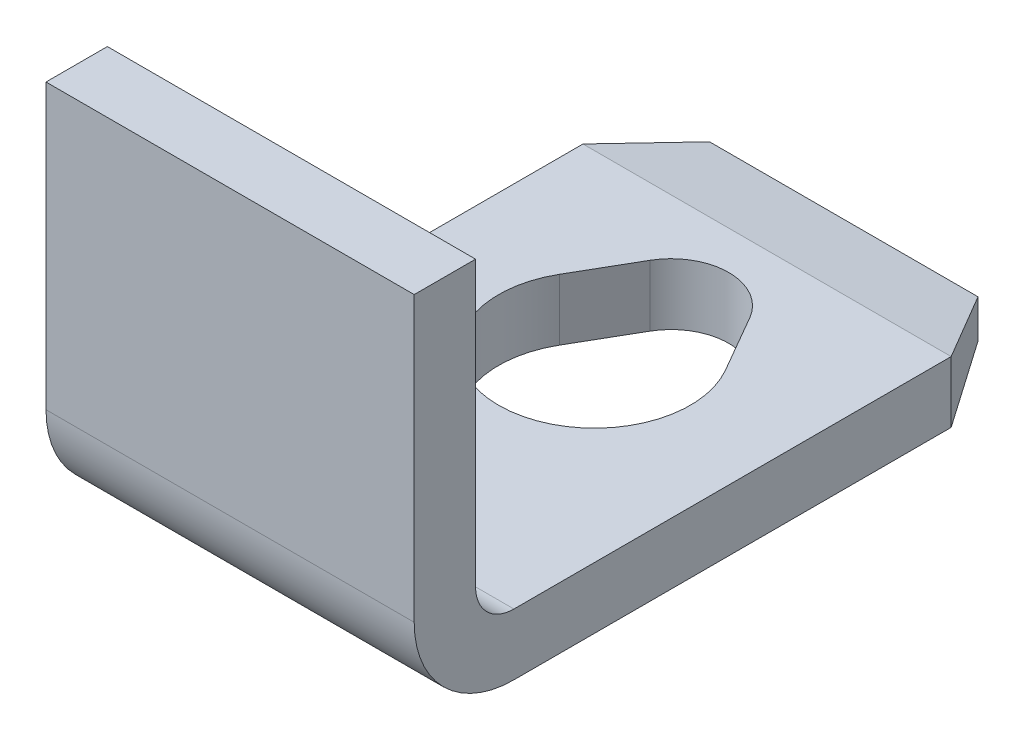
ISO-10303-21;
HEADER;
FILE_DESCRIPTION(('STEP AP214'),'2;1');
FILE_NAME('part.step','',(''),(''),'','','');
FILE_SCHEMA(('AUTOMOTIVE_DESIGN { 1 0 10303 214 1 1 1 1 }'));
ENDSEC;
DATA;
#1=APPLICATION_CONTEXT('core data for automotive mechanical design processes');
#2=APPLICATION_PROTOCOL_DEFINITION('international standard','automotive_design',2000,#1);
#3=PRODUCT_CONTEXT('',#1,'mechanical');
#4=PRODUCT('Part','Part','',(#3));
#5=PRODUCT_RELATED_PRODUCT_CATEGORY('part','',(#4));
#6=PRODUCT_DEFINITION_FORMATION('','',#4);
#7=PRODUCT_DEFINITION_CONTEXT('part definition',#1,'design');
#8=PRODUCT_DEFINITION('design','',#6,#7);
#9=PRODUCT_DEFINITION_SHAPE('','',#8);
#10=(LENGTH_UNIT() NAMED_UNIT(*) SI_UNIT(.MILLI.,.METRE.));
#11=(NAMED_UNIT(*) PLANE_ANGLE_UNIT() SI_UNIT($,.RADIAN.));
#12=(NAMED_UNIT(*) SI_UNIT($,.STERADIAN.) SOLID_ANGLE_UNIT());
#13=UNCERTAINTY_MEASURE_WITH_UNIT(LENGTH_MEASURE(1.E-05),#10,'distance_accuracy_value','');
#14=(GEOMETRIC_REPRESENTATION_CONTEXT(3) GLOBAL_UNCERTAINTY_ASSIGNED_CONTEXT((#13)) GLOBAL_UNIT_ASSIGNED_CONTEXT((#10,
#11,#12)) REPRESENTATION_CONTEXT('',''));
#15=CARTESIAN_POINT('',(0.,0.,0.));
#16=DIRECTION('',(0.,0.,1.));
#17=DIRECTION('',(1.,0.,0.));
#18=AXIS2_PLACEMENT_3D('',#15,#16,#17);
#19=CARTESIAN_POINT('',(-5.2,-5.75,-16.6));
#20=DIRECTION('',(0.,0.,1.));
#21=DIRECTION('',(1.,0.,0.));
#22=AXIS2_PLACEMENT_3D('',#19,#20,#21);
#23=PLANE('',#22);
#24=DIRECTION('',(0.,1.,0.));
#25=VECTOR('',#24,1.);
#26=CARTESIAN_POINT('',(-5.2,-4.95,-16.6));
#27=LINE('',#26,#25);
#28=CARTESIAN_POINT('',(-5.2,-0.75,-16.6));
#29=VERTEX_POINT('',#28);
#30=CARTESIAN_POINT('',(-5.2,-4.45,-16.6));
#31=VERTEX_POINT('',#30);
#32=EDGE_CURVE('E162',#29,#31,#27,.F.);
#33=ORIENTED_EDGE('',*,*,#32,.F.);
#34=DIRECTION('',(1.,0.,0.));
#35=VECTOR('',#34,1.);
#36=CARTESIAN_POINT('',(-5.2,-0.75,-16.6));
#37=LINE('',#36,#35);
#38=CARTESIAN_POINT('',(-10.,-0.75,-16.6));
#39=VERTEX_POINT('',#38);
#40=EDGE_CURVE('E160',#39,#29,#37,.T.);
#41=ORIENTED_EDGE('',*,*,#40,.F.);
#42=DIRECTION('',(0.,1.,0.));
#43=VECTOR('',#42,1.);
#44=CARTESIAN_POINT('',(-10.,-4.45,-16.6));
#45=LINE('',#44,#43);
#46=CARTESIAN_POINT('',(-10.,-4.45,-16.6));
#47=VERTEX_POINT('',#46);
#48=EDGE_CURVE('E156',#39,#47,#45,.F.);
#49=ORIENTED_EDGE('',*,*,#48,.T.);
#50=DIRECTION('',(-1.,0.,0.));
#51=VECTOR('',#50,1.);
#52=CARTESIAN_POINT('',(-5.2,-4.45,-16.6));
#53=LINE('',#52,#51);
#54=EDGE_CURVE('E175',#31,#47,#53,.T.);
#55=ORIENTED_EDGE('',*,*,#54,.F.);
#56=EDGE_LOOP('',(#33,#41,#49,#55));
#57=FACE_BOUND('',#56,.T.);
#58=ADVANCED_FACE('F17',(#57),#23,.T.);
#59=CARTESIAN_POINT('',(-5.2,-0.75,-16.6));
#60=DIRECTION('',(0.,1.,0.));
#61=DIRECTION('',(0.,0.,1.));
#62=AXIS2_PLACEMENT_3D('',#59,#60,#61);
#63=PLANE('',#62);
#64=DIRECTION('',(0.,0.,1.));
#65=VECTOR('',#64,1.);
#66=CARTESIAN_POINT('',(-5.2,-0.75,-16.6));
#67=LINE('',#66,#65);
#68=CARTESIAN_POINT('',(-5.2,-0.75,-17.4));
#69=VERTEX_POINT('',#68);
#70=EDGE_CURVE('E157',#29,#69,#67,.F.);
#71=ORIENTED_EDGE('',*,*,#70,.T.);
#72=DIRECTION('',(1.,0.,0.));
#73=VECTOR('',#72,1.);
#74=CARTESIAN_POINT('',(-5.2,-0.75,-17.4));
#75=LINE('',#74,#73);
#76=CARTESIAN_POINT('',(-10.,-0.75,-17.4));
#77=VERTEX_POINT('',#76);
#78=EDGE_CURVE('E137',#69,#77,#75,.F.);
#79=ORIENTED_EDGE('',*,*,#78,.T.);
#80=DIRECTION('',(0.,0.,-1.));
#81=VECTOR('',#80,1.);
#82=CARTESIAN_POINT('',(-10.,-0.75,-17.9));
#83=LINE('',#82,#81);
#84=EDGE_CURVE('E132',#77,#39,#83,.F.);
#85=ORIENTED_EDGE('',*,*,#84,.T.);
#86=ORIENTED_EDGE('',*,*,#40,.T.);
#87=EDGE_LOOP('',(#71,#79,#85,#86));
#88=FACE_BOUND('',#87,.T.);
#89=ADVANCED_FACE('F241',(#88),#63,.T.);
#90=CARTESIAN_POINT('',(-25.5,-5.6,-24.6));
#91=DIRECTION('',(0.,0.988936352868298,0.148340452930245));
#92=DIRECTION('',(0.,-0.148340452930245,0.988936352868298));
#93=AXIS2_PLACEMENT_3D('',#90,#91,#92);
#94=PLANE('',#93);
#95=DIRECTION('',(0.540728715025006,0.124783549621157,-0.831890330807703));
#96=VECTOR('',#95,1.);
#97=CARTESIAN_POINT('',(-10.,-5.75,-23.6));
#98=LINE('',#97,#96);
#99=CARTESIAN_POINT('',(-9.99999999999999,-5.75,-23.6));
#100=VERTEX_POINT('',#99);
#101=CARTESIAN_POINT('',(-9.35,-5.6,-24.6));
#102=VERTEX_POINT('',#101);
#103=EDGE_CURVE('E136',#100,#102,#98,.T.);
#104=ORIENTED_EDGE('',*,*,#103,.T.);
#105=DIRECTION('',(-1.,0.,0.));
#106=VECTOR('',#105,1.);
#107=CARTESIAN_POINT('',(-5.2,-5.6,-24.6));
#108=LINE('',#107,#106);
#109=CARTESIAN_POINT('',(-5.84999999999999,-5.6,-24.6));
#110=VERTEX_POINT('',#109);
#111=EDGE_CURVE('E252',#110,#102,#108,.T.);
#112=ORIENTED_EDGE('',*,*,#111,.F.);
#113=DIRECTION('',(0.540728715025007,-0.124783549621156,0.831890330807703));
#114=VECTOR('',#113,1.);
#115=CARTESIAN_POINT('',(-5.85,-5.6,-24.6));
#116=LINE('',#115,#114);
#117=CARTESIAN_POINT('',(-5.19999999999999,-5.75,-23.6));
#118=VERTEX_POINT('',#117);
#119=EDGE_CURVE('E219',#110,#118,#116,.T.);
#120=ORIENTED_EDGE('',*,*,#119,.T.);
#121=DIRECTION('',(1.,0.,0.));
#122=VECTOR('',#121,1.);
#123=CARTESIAN_POINT('',(-5.2,-5.75,-23.6));
#124=LINE('',#123,#122);
#125=EDGE_CURVE('E215',#100,#118,#124,.T.);
#126=ORIENTED_EDGE('',*,*,#125,.F.);
#127=EDGE_LOOP('',(#104,#112,#120,#126));
#128=FACE_BOUND('',#127,.T.);
#129=ADVANCED_FACE('F216',(#128),#94,.F.);
#130=CARTESIAN_POINT('',(-5.2,-4.45,-17.9));
#131=DIRECTION('',(-1.,0.,0.));
#132=DIRECTION('',(0.,0.,1.));
#133=AXIS2_PLACEMENT_3D('',#130,#131,#132);
#134=CYLINDRICAL_SURFACE('',#133,1.3);
#135=CARTESIAN_POINT('',(-5.2,-4.45,-17.9));
#136=DIRECTION('',(-1.,0.,0.));
#137=DIRECTION('',(0.,0.,1.));
#138=AXIS2_PLACEMENT_3D('',#135,#136,#137);
#139=CIRCLE('',#138,1.3);
#140=CARTESIAN_POINT('',(-5.2,-5.75,-17.9));
#141=VERTEX_POINT('',#140);
#142=EDGE_CURVE('E195',#141,#31,#139,.T.);
#143=ORIENTED_EDGE('',*,*,#142,.T.);
#144=ORIENTED_EDGE('',*,*,#54,.T.);
#145=CARTESIAN_POINT('',(-10.,-4.45,-17.9));
#146=DIRECTION('',(-1.,0.,0.));
#147=DIRECTION('',(0.,0.,1.));
#148=AXIS2_PLACEMENT_3D('',#145,#146,#147);
#149=CIRCLE('',#148,1.3);
#150=CARTESIAN_POINT('',(-10.,-5.75,-17.9));
#151=VERTEX_POINT('',#150);
#152=EDGE_CURVE('E198',#47,#151,#149,.F.);
#153=ORIENTED_EDGE('',*,*,#152,.T.);
#154=DIRECTION('',(1.,0.,0.));
#155=VECTOR('',#154,1.);
#156=CARTESIAN_POINT('',(-5.2,-5.75,-17.9));
#157=LINE('',#156,#155);
#158=EDGE_CURVE('E194',#141,#151,#157,.F.);
#159=ORIENTED_EDGE('',*,*,#158,.F.);
#160=EDGE_LOOP('',(#143,#144,#153,#159));
#161=FACE_BOUND('',#160,.T.);
#162=ADVANCED_FACE('F243',(#161),#134,.T.);
#163=CARTESIAN_POINT('',(-5.2,-5.75,-17.4));
#164=DIRECTION('',(0.,0.,1.));
#165=DIRECTION('',(1.,0.,0.));
#166=AXIS2_PLACEMENT_3D('',#163,#164,#165);
#167=PLANE('',#166);
#168=ORIENTED_EDGE('',*,*,#78,.F.);
#169=DIRECTION('',(0.,1.,0.));
#170=VECTOR('',#169,1.);
#171=CARTESIAN_POINT('',(-5.2,-5.75,-17.4));
#172=LINE('',#171,#170);
#173=CARTESIAN_POINT('',(-5.2,-4.45,-17.4));
#174=VERTEX_POINT('',#173);
#175=EDGE_CURVE('E142',#174,#69,#172,.T.);
#176=ORIENTED_EDGE('',*,*,#175,.F.);
#177=DIRECTION('',(-1.,0.,0.));
#178=VECTOR('',#177,1.);
#179=CARTESIAN_POINT('',(-5.2,-4.45,-17.4));
#180=LINE('',#179,#178);
#181=CARTESIAN_POINT('',(-10.,-4.45,-17.4));
#182=VERTEX_POINT('',#181);
#183=EDGE_CURVE('E119',#174,#182,#180,.T.);
#184=ORIENTED_EDGE('',*,*,#183,.T.);
#185=DIRECTION('',(0.,1.,0.));
#186=VECTOR('',#185,1.);
#187=CARTESIAN_POINT('',(-10.,-5.75,-17.4));
#188=LINE('',#187,#186);
#189=EDGE_CURVE('E127',#77,#182,#188,.F.);
#190=ORIENTED_EDGE('',*,*,#189,.F.);
#191=EDGE_LOOP('',(#168,#176,#184,#190));
#192=FACE_BOUND('',#191,.T.);
#193=ADVANCED_FACE('F140',(#192),#167,.F.);
#194=CARTESIAN_POINT('',(-9.35,-11.25,-24.6));
#195=DIRECTION('',(0.838443616300637,0.,0.544988350595414));
#196=DIRECTION('',(0.544988350595414,0.,-0.838443616300637));
#197=AXIS2_PLACEMENT_3D('',#194,#195,#196);
#198=PLANE('',#197);
#199=ORIENTED_EDGE('',*,*,#103,.F.);
#200=DIRECTION('',(0.,1.,0.));
#201=VECTOR('',#200,1.);
#202=CARTESIAN_POINT('',(-10.,-4.45,-23.6));
#203=LINE('',#202,#201);
#204=CARTESIAN_POINT('',(-10.,-4.95,-23.6));
#205=VERTEX_POINT('',#204);
#206=EDGE_CURVE('E143',#205,#100,#203,.F.);
#207=ORIENTED_EDGE('',*,*,#206,.F.);
#208=DIRECTION('',(0.540728715025004,-0.124783549621157,-0.831890330807705));
#209=VECTOR('',#208,1.);
#210=CARTESIAN_POINT('',(-10.,-4.95,-23.6));
#211=LINE('',#210,#209);
#212=CARTESIAN_POINT('',(-9.35000000000001,-5.1,-24.6));
#213=VERTEX_POINT('',#212);
#214=EDGE_CURVE('E228',#205,#213,#211,.T.);
#215=ORIENTED_EDGE('',*,*,#214,.T.);
#216=DIRECTION('',(0.,1.,0.));
#217=VECTOR('',#216,1.);
#218=CARTESIAN_POINT('',(-9.35,-4.95,-24.6));
#219=LINE('',#218,#217);
#220=EDGE_CURVE('E254',#102,#213,#219,.T.);
#221=ORIENTED_EDGE('',*,*,#220,.F.);
#222=EDGE_LOOP('',(#199,#207,#215,#221));
#223=FACE_BOUND('',#222,.T.);
#224=ADVANCED_FACE('F279',(#223),#198,.F.);
#225=CARTESIAN_POINT('',(-5.2,-4.95,-24.6));
#226=DIRECTION('',(0.,0.,-1.));
#227=DIRECTION('',(-1.,0.,0.));
#228=AXIS2_PLACEMENT_3D('',#225,#226,#227);
#229=PLANE('',#228);
#230=DIRECTION('',(1.,0.,0.));
#231=VECTOR('',#230,1.);
#232=CARTESIAN_POINT('',(-25.5,-5.1,-24.6));
#233=LINE('',#232,#231);
#234=CARTESIAN_POINT('',(-5.84999999999999,-5.1,-24.6));
#235=VERTEX_POINT('',#234);
#236=EDGE_CURVE('E245',#213,#235,#233,.T.);
#237=ORIENTED_EDGE('',*,*,#236,.T.);
#238=DIRECTION('',(0.,1.,0.));
#239=VECTOR('',#238,1.);
#240=CARTESIAN_POINT('',(-5.84999999999999,-11.25,-24.6));
#241=LINE('',#240,#239);
#242=EDGE_CURVE('E256',#235,#110,#241,.F.);
#243=ORIENTED_EDGE('',*,*,#242,.T.);
#244=ORIENTED_EDGE('',*,*,#111,.T.);
#245=ORIENTED_EDGE('',*,*,#220,.T.);
#246=EDGE_LOOP('',(#237,#243,#244,#245));
#247=FACE_BOUND('',#246,.T.);
#248=ADVANCED_FACE('F281',(#247),#229,.T.);
#249=CARTESIAN_POINT('',(-5.85,-11.25,-24.6));
#250=DIRECTION('',(-0.838443616300637,0.,0.544988350595414));
#251=DIRECTION('',(0.544988350595414,0.,0.838443616300637));
#252=AXIS2_PLACEMENT_3D('',#249,#250,#251);
#253=PLANE('',#252);
#254=ORIENTED_EDGE('',*,*,#119,.F.);
#255=ORIENTED_EDGE('',*,*,#242,.F.);
#256=DIRECTION('',(0.540728715025006,0.124783549621157,0.831890330807703));
#257=VECTOR('',#256,1.);
#258=CARTESIAN_POINT('',(-5.84999999999999,-5.1,-24.6));
#259=LINE('',#258,#257);
#260=CARTESIAN_POINT('',(-5.2,-4.95,-23.6));
#261=VERTEX_POINT('',#260);
#262=EDGE_CURVE('E226',#235,#261,#259,.T.);
#263=ORIENTED_EDGE('',*,*,#262,.T.);
#264=DIRECTION('',(0.,1.,0.));
#265=VECTOR('',#264,1.);
#266=CARTESIAN_POINT('',(-5.2,-4.45,-23.6));
#267=LINE('',#266,#265);
#268=EDGE_CURVE('E34',#118,#261,#267,.T.);
#269=ORIENTED_EDGE('',*,*,#268,.F.);
#270=EDGE_LOOP('',(#254,#255,#263,#269));
#271=FACE_BOUND('',#270,.T.);
#272=ADVANCED_FACE('F283',(#271),#253,.F.);
#273=CARTESIAN_POINT('',(-5.2,-5.75,-16.6));
#274=DIRECTION('',(0.,-1.,0.));
#275=DIRECTION('',(0.,0.,-1.));
#276=AXIS2_PLACEMENT_3D('',#273,#274,#275);
#277=PLANE('',#276);
#278=DIRECTION('',(-0.499999999999999,0.,0.866025403784439));
#279=VECTOR('',#278,1.);
#280=CARTESIAN_POINT('',(-8.68253175473055,-5.75,-21.975));
#281=LINE('',#280,#279);
#282=CARTESIAN_POINT('',(-8.24951905283833,-5.75,-22.725));
#283=VERTEX_POINT('',#282);
#284=CARTESIAN_POINT('',(-8.68253175473055,-5.75,-21.975));
#285=VERTEX_POINT('',#284);
#286=EDGE_CURVE('E248',#283,#285,#281,.T.);
#287=ORIENTED_EDGE('',*,*,#286,.T.);
#288=CARTESIAN_POINT('',(-7.6,-5.75,-21.35));
#289=DIRECTION('',(0.,1.,0.));
#290=DIRECTION('',(0.,0.,1.));
#291=AXIS2_PLACEMENT_3D('',#288,#289,#290);
#292=CIRCLE('',#291,1.25);
#293=CARTESIAN_POINT('',(-6.51746824526945,-5.75,-21.975));
#294=VERTEX_POINT('',#293);
#295=EDGE_CURVE('E187',#285,#294,#292,.T.);
#296=ORIENTED_EDGE('',*,*,#295,.T.);
#297=DIRECTION('',(-0.5,0.,-0.866025403784439));
#298=VECTOR('',#297,1.);
#299=CARTESIAN_POINT('',(-6.95048094716167,-5.75,-22.725));
#300=LINE('',#299,#298);
#301=CARTESIAN_POINT('',(-6.95048094716167,-5.75,-22.725));
#302=VERTEX_POINT('',#301);
#303=EDGE_CURVE('E144',#294,#302,#300,.T.);
#304=ORIENTED_EDGE('',*,*,#303,.T.);
#305=CARTESIAN_POINT('',(-7.6,-5.75,-22.35));
#306=DIRECTION('',(0.,1.,0.));
#307=DIRECTION('',(0.,0.,1.));
#308=AXIS2_PLACEMENT_3D('',#305,#306,#307);
#309=CIRCLE('',#308,0.750000000000001);
#310=EDGE_CURVE('E191',#302,#283,#309,.T.);
#311=ORIENTED_EDGE('',*,*,#310,.T.);
#312=EDGE_LOOP('',(#287,#296,#304,#311));
#313=FACE_BOUND('',#312,.T.);
#314=ORIENTED_EDGE('',*,*,#158,.T.);
#315=DIRECTION('',(0.,0.,1.));
#316=VECTOR('',#315,1.);
#317=CARTESIAN_POINT('',(-10.,-5.75,-17.4));
#318=LINE('',#317,#316);
#319=EDGE_CURVE('E147',#100,#151,#318,.T.);
#320=ORIENTED_EDGE('',*,*,#319,.F.);
#321=ORIENTED_EDGE('',*,*,#125,.T.);
#322=DIRECTION('',(0.,0.,-1.));
#323=VECTOR('',#322,1.);
#324=CARTESIAN_POINT('',(-5.2,-5.75,-17.9));
#325=LINE('',#324,#323);
#326=EDGE_CURVE('E186',#141,#118,#325,.T.);
#327=ORIENTED_EDGE('',*,*,#326,.F.);
#328=EDGE_LOOP('',(#314,#320,#321,#327));
#329=FACE_BOUND('',#328,.T.);
#330=ADVANCED_FACE('F224',(#313,#329),#277,.T.);
#331=CARTESIAN_POINT('',(-7.6,-11.25,-22.35));
#332=DIRECTION('',(0.,1.,0.));
#333=DIRECTION('',(0.,0.,1.));
#334=AXIS2_PLACEMENT_3D('',#331,#332,#333);
#335=CYLINDRICAL_SURFACE('',#334,0.750000000000001);
#336=DIRECTION('',(0.,1.,0.));
#337=VECTOR('',#336,1.);
#338=CARTESIAN_POINT('',(-6.95048094716167,-11.25,-22.725));
#339=LINE('',#338,#337);
#340=CARTESIAN_POINT('',(-6.95048094716167,-4.95,-22.725));
#341=VERTEX_POINT('',#340);
#342=EDGE_CURVE('E189',#302,#341,#339,.T.);
#343=ORIENTED_EDGE('',*,*,#342,.T.);
#344=CARTESIAN_POINT('',(-7.6,-4.95,-22.35));
#345=DIRECTION('',(0.,1.,0.));
#346=DIRECTION('',(0.,0.,1.));
#347=AXIS2_PLACEMENT_3D('',#344,#345,#346);
#348=CIRCLE('',#347,0.750000000000001);
#349=CARTESIAN_POINT('',(-8.24951905283833,-4.95,-22.725));
#350=VERTEX_POINT('',#349);
#351=EDGE_CURVE('E183',#341,#350,#348,.T.);
#352=ORIENTED_EDGE('',*,*,#351,.T.);
#353=DIRECTION('',(0.,1.,0.));
#354=VECTOR('',#353,1.);
#355=CARTESIAN_POINT('',(-8.24951905283833,-11.25,-22.725));
#356=LINE('',#355,#354);
#357=EDGE_CURVE('E193',#350,#283,#356,.F.);
#358=ORIENTED_EDGE('',*,*,#357,.T.);
#359=ORIENTED_EDGE('',*,*,#310,.F.);
#360=EDGE_LOOP('',(#343,#352,#358,#359));
#361=FACE_BOUND('',#360,.T.);
#362=ADVANCED_FACE('F291',(#361),#335,.F.);
#363=CARTESIAN_POINT('',(-8.68253175473055,-11.25,-21.975));
#364=DIRECTION('',(-0.866025403784439,0.,-0.499999999999999));
#365=DIRECTION('',(-0.499999999999999,0.,0.866025403784439));
#366=AXIS2_PLACEMENT_3D('',#363,#364,#365);
#367=PLANE('',#366);
#368=ORIENTED_EDGE('',*,*,#357,.F.);
#369=DIRECTION('',(-0.499999999999998,0.,0.866025403784439));
#370=VECTOR('',#369,1.);
#371=CARTESIAN_POINT('',(-8.24951905283833,-4.95,-22.725));
#372=LINE('',#371,#370);
#373=CARTESIAN_POINT('',(-8.68253175473055,-4.95,-21.975));
#374=VERTEX_POINT('',#373);
#375=EDGE_CURVE('E182',#350,#374,#372,.T.);
#376=ORIENTED_EDGE('',*,*,#375,.T.);
#377=DIRECTION('',(0.,1.,0.));
#378=VECTOR('',#377,1.);
#379=CARTESIAN_POINT('',(-8.68253175473055,-11.25,-21.975));
#380=LINE('',#379,#378);
#381=EDGE_CURVE('E190',#374,#285,#380,.F.);
#382=ORIENTED_EDGE('',*,*,#381,.T.);
#383=ORIENTED_EDGE('',*,*,#286,.F.);
#384=EDGE_LOOP('',(#368,#376,#382,#383));
#385=FACE_BOUND('',#384,.T.);
#386=ADVANCED_FACE('F315',(#385),#367,.F.);
#387=CARTESIAN_POINT('',(-7.6,-11.25,-21.35));
#388=DIRECTION('',(0.,1.,0.));
#389=DIRECTION('',(0.,0.,1.));
#390=AXIS2_PLACEMENT_3D('',#387,#388,#389);
#391=CYLINDRICAL_SURFACE('',#390,1.25);
#392=ORIENTED_EDGE('',*,*,#295,.F.);
#393=ORIENTED_EDGE('',*,*,#381,.F.);
#394=CARTESIAN_POINT('',(-7.6,-4.95,-21.35));
#395=DIRECTION('',(0.,1.,0.));
#396=DIRECTION('',(0.,0.,1.));
#397=AXIS2_PLACEMENT_3D('',#394,#395,#396);
#398=CIRCLE('',#397,1.25);
#399=CARTESIAN_POINT('',(-6.51746824526945,-4.95,-21.975));
#400=VERTEX_POINT('',#399);
#401=EDGE_CURVE('E180',#374,#400,#398,.T.);
#402=ORIENTED_EDGE('',*,*,#401,.T.);
#403=DIRECTION('',(0.,1.,0.));
#404=VECTOR('',#403,1.);
#405=CARTESIAN_POINT('',(-6.51746824526945,-11.25,-21.975));
#406=LINE('',#405,#404);
#407=EDGE_CURVE('E150',#400,#294,#406,.F.);
#408=ORIENTED_EDGE('',*,*,#407,.T.);
#409=EDGE_LOOP('',(#392,#393,#402,#408));
#410=FACE_BOUND('',#409,.T.);
#411=ADVANCED_FACE('F311',(#410),#391,.F.);
#412=CARTESIAN_POINT('',(-6.95048094716167,-11.25,-22.725));
#413=DIRECTION('',(0.866025403784439,0.,-0.5));
#414=DIRECTION('',(-0.5,0.,-0.866025403784439));
#415=AXIS2_PLACEMENT_3D('',#412,#413,#414);
#416=PLANE('',#415);
#417=ORIENTED_EDGE('',*,*,#407,.F.);
#418=DIRECTION('',(-0.499999999999999,0.,-0.866025403784439));
#419=VECTOR('',#418,1.);
#420=CARTESIAN_POINT('',(-6.51746824526945,-4.95,-21.975));
#421=LINE('',#420,#419);
#422=EDGE_CURVE('E177',#400,#341,#421,.T.);
#423=ORIENTED_EDGE('',*,*,#422,.T.);
#424=ORIENTED_EDGE('',*,*,#342,.F.);
#425=ORIENTED_EDGE('',*,*,#303,.F.);
#426=EDGE_LOOP('',(#417,#423,#424,#425));
#427=FACE_BOUND('',#426,.T.);
#428=ADVANCED_FACE('F308',(#427),#416,.F.);
#429=CARTESIAN_POINT('',(-5.2,-4.45,-17.9));
#430=DIRECTION('',(-1.,0.,0.));
#431=DIRECTION('',(0.,0.,1.));
#432=AXIS2_PLACEMENT_3D('',#429,#430,#431);
#433=CYLINDRICAL_SURFACE('',#432,0.5);
#434=ORIENTED_EDGE('',*,*,#183,.F.);
#435=CARTESIAN_POINT('',(-5.2,-4.45,-17.9));
#436=DIRECTION('',(-1.,0.,0.));
#437=DIRECTION('',(0.,0.,1.));
#438=AXIS2_PLACEMENT_3D('',#435,#436,#437);
#439=CIRCLE('',#438,0.5);
#440=CARTESIAN_POINT('',(-5.2,-4.95,-17.9));
#441=VERTEX_POINT('',#440);
#442=EDGE_CURVE('E125',#441,#174,#439,.T.);
#443=ORIENTED_EDGE('',*,*,#442,.F.);
#444=DIRECTION('',(1.,0.,0.));
#445=VECTOR('',#444,1.);
#446=CARTESIAN_POINT('',(-5.2,-4.95,-17.9));
#447=LINE('',#446,#445);
#448=CARTESIAN_POINT('',(-10.,-4.95,-17.9));
#449=VERTEX_POINT('',#448);
#450=EDGE_CURVE('E121',#441,#449,#447,.F.);
#451=ORIENTED_EDGE('',*,*,#450,.T.);
#452=CARTESIAN_POINT('',(-10.,-4.45,-17.9));
#453=DIRECTION('',(-1.,0.,0.));
#454=DIRECTION('',(0.,0.,1.));
#455=AXIS2_PLACEMENT_3D('',#452,#453,#454);
#456=CIRCLE('',#455,0.5);
#457=EDGE_CURVE('E20',#182,#449,#456,.F.);
#458=ORIENTED_EDGE('',*,*,#457,.F.);
#459=EDGE_LOOP('',(#434,#443,#451,#458));
#460=FACE_BOUND('',#459,.T.);
#461=ADVANCED_FACE('F116',(#460),#433,.F.);
#462=CARTESIAN_POINT('',(-10.,-4.45,-17.4));
#463=DIRECTION('',(-1.,0.,0.));
#464=DIRECTION('',(0.,0.,1.));
#465=AXIS2_PLACEMENT_3D('',#462,#463,#464);
#466=PLANE('',#465);
#467=ORIENTED_EDGE('',*,*,#319,.T.);
#468=ORIENTED_EDGE('',*,*,#152,.F.);
#469=ORIENTED_EDGE('',*,*,#48,.F.);
#470=ORIENTED_EDGE('',*,*,#84,.F.);
#471=ORIENTED_EDGE('',*,*,#189,.T.);
#472=ORIENTED_EDGE('',*,*,#457,.T.);
#473=DIRECTION('',(0.,0.,-1.));
#474=VECTOR('',#473,1.);
#475=CARTESIAN_POINT('',(-10.,-4.95,-16.6));
#476=LINE('',#475,#474);
#477=EDGE_CURVE('E176',#449,#205,#476,.T.);
#478=ORIENTED_EDGE('',*,*,#477,.T.);
#479=ORIENTED_EDGE('',*,*,#206,.T.);
#480=EDGE_LOOP('',(#467,#468,#469,#470,#471,#472,#478,#479));
#481=FACE_BOUND('',#480,.T.);
#482=ADVANCED_FACE('F129',(#481),#466,.T.);
#483=CARTESIAN_POINT('',(-25.5,-5.1,-24.6));
#484=DIRECTION('',(0.,-0.988936352868297,0.148340452930246));
#485=DIRECTION('',(0.,-0.148340452930246,-0.988936352868297));
#486=AXIS2_PLACEMENT_3D('',#483,#484,#485);
#487=PLANE('',#486);
#488=ORIENTED_EDGE('',*,*,#214,.F.);
#489=DIRECTION('',(1.,0.,0.));
#490=VECTOR('',#489,1.);
#491=CARTESIAN_POINT('',(-5.2,-4.95,-23.6));
#492=LINE('',#491,#490);
#493=EDGE_CURVE('E26',#205,#261,#492,.T.);
#494=ORIENTED_EDGE('',*,*,#493,.T.);
#495=ORIENTED_EDGE('',*,*,#262,.F.);
#496=ORIENTED_EDGE('',*,*,#236,.F.);
#497=EDGE_LOOP('',(#488,#494,#495,#496));
#498=FACE_BOUND('',#497,.T.);
#499=ADVANCED_FACE('F277',(#498),#487,.F.);
#500=CARTESIAN_POINT('',(-5.2,-4.45,-17.9));
#501=DIRECTION('',(1.,0.,0.));
#502=DIRECTION('',(0.,0.,-1.));
#503=AXIS2_PLACEMENT_3D('',#500,#501,#502);
#504=PLANE('',#503);
#505=DIRECTION('',(0.,0.,-1.));
#506=VECTOR('',#505,1.);
#507=CARTESIAN_POINT('',(-5.19999999999999,-4.95,-16.6));
#508=LINE('',#507,#506);
#509=EDGE_CURVE('E11',#261,#441,#508,.F.);
#510=ORIENTED_EDGE('',*,*,#509,.T.);
#511=ORIENTED_EDGE('',*,*,#442,.T.);
#512=ORIENTED_EDGE('',*,*,#175,.T.);
#513=ORIENTED_EDGE('',*,*,#70,.F.);
#514=ORIENTED_EDGE('',*,*,#32,.T.);
#515=ORIENTED_EDGE('',*,*,#142,.F.);
#516=ORIENTED_EDGE('',*,*,#326,.T.);
#517=ORIENTED_EDGE('',*,*,#268,.T.);
#518=EDGE_LOOP('',(#510,#511,#512,#513,#514,#515,#516,#517));
#519=FACE_BOUND('',#518,.T.);
#520=ADVANCED_FACE('F199',(#519),#504,.T.);
#521=CARTESIAN_POINT('',(-5.2,-4.95,-16.6));
#522=DIRECTION('',(0.,-1.,0.));
#523=DIRECTION('',(0.,0.,-1.));
#524=AXIS2_PLACEMENT_3D('',#521,#522,#523);
#525=PLANE('',#524);
#526=ORIENTED_EDGE('',*,*,#493,.F.);
#527=ORIENTED_EDGE('',*,*,#477,.F.);
#528=ORIENTED_EDGE('',*,*,#450,.F.);
#529=ORIENTED_EDGE('',*,*,#509,.F.);
#530=EDGE_LOOP('',(#526,#527,#528,#529));
#531=FACE_BOUND('',#530,.T.);
#532=ORIENTED_EDGE('',*,*,#422,.F.);
#533=ORIENTED_EDGE('',*,*,#401,.F.);
#534=ORIENTED_EDGE('',*,*,#375,.F.);
#535=ORIENTED_EDGE('',*,*,#351,.F.);
#536=EDGE_LOOP('',(#532,#533,#534,#535));
#537=FACE_BOUND('',#536,.T.);
#538=ADVANCED_FACE('F205',(#531,#537),#525,.F.);
#539=CLOSED_SHELL('',(#58,#89,#129,#162,#193,#224,#248,#272,#330,#362,#386,#411,#428,#461,#482,
#499,#520,#538));
#540=MANIFOLD_SOLID_BREP('B1',#539);
#541=ADVANCED_BREP_SHAPE_REPRESENTATION('',(#18,#540),#14);
#542=SHAPE_DEFINITION_REPRESENTATION(#9,#541);
ENDSEC;
END-ISO-10303-21;
